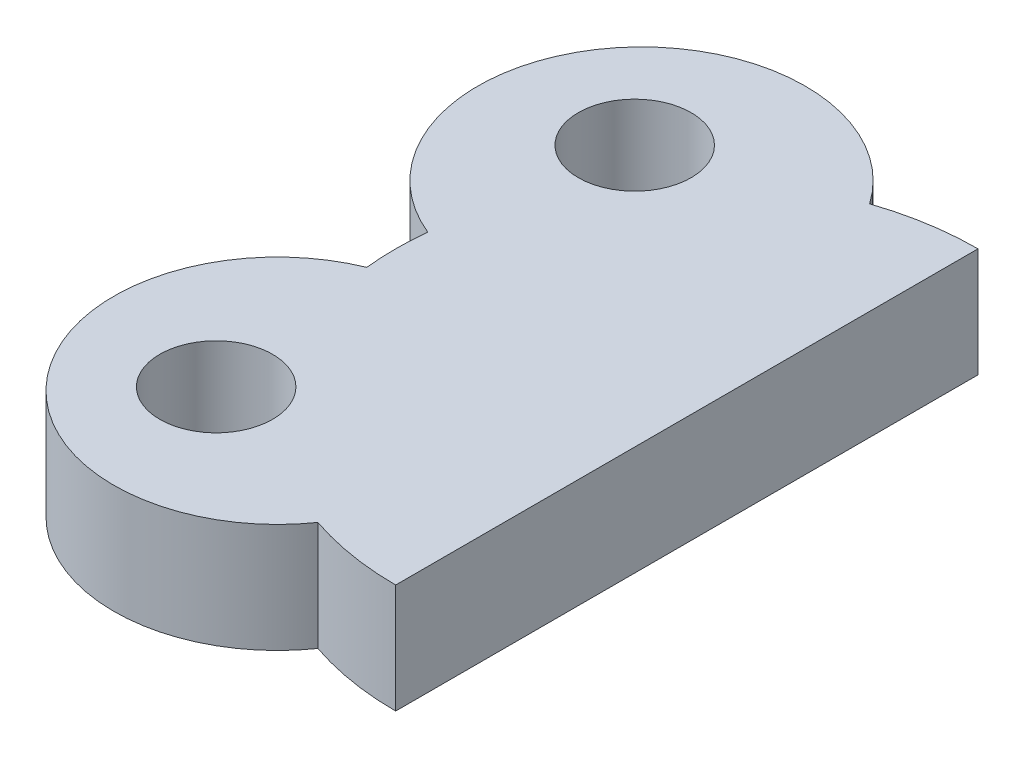
ISO-10303-21;
HEADER;
FILE_DESCRIPTION(('STEP AP214'),'2;1');
FILE_NAME('part.step','',(''),(''),'','','');
FILE_SCHEMA(('AUTOMOTIVE_DESIGN { 1 0 10303 214 1 1 1 1 }'));
ENDSEC;
DATA;
#1=APPLICATION_CONTEXT('core data for automotive mechanical design processes');
#2=APPLICATION_PROTOCOL_DEFINITION('international standard','automotive_design',2000,#1);
#3=PRODUCT_CONTEXT('',#1,'mechanical');
#4=PRODUCT('Part','Part','',(#3));
#5=PRODUCT_RELATED_PRODUCT_CATEGORY('part','',(#4));
#6=PRODUCT_DEFINITION_FORMATION('','',#4);
#7=PRODUCT_DEFINITION_CONTEXT('part definition',#1,'design');
#8=PRODUCT_DEFINITION('design','',#6,#7);
#9=PRODUCT_DEFINITION_SHAPE('','',#8);
#10=(LENGTH_UNIT() NAMED_UNIT(*) SI_UNIT(.MILLI.,.METRE.));
#11=(NAMED_UNIT(*) PLANE_ANGLE_UNIT() SI_UNIT($,.RADIAN.));
#12=(NAMED_UNIT(*) SI_UNIT($,.STERADIAN.) SOLID_ANGLE_UNIT());
#13=UNCERTAINTY_MEASURE_WITH_UNIT(LENGTH_MEASURE(1.E-05),#10,'distance_accuracy_value','');
#14=(GEOMETRIC_REPRESENTATION_CONTEXT(3) GLOBAL_UNCERTAINTY_ASSIGNED_CONTEXT((#13)) GLOBAL_UNIT_ASSIGNED_CONTEXT((#10,
#11,#12)) REPRESENTATION_CONTEXT('',''));
#15=CARTESIAN_POINT('',(0.,0.,0.));
#16=DIRECTION('',(0.,0.,1.));
#17=DIRECTION('',(1.,0.,0.));
#18=AXIS2_PLACEMENT_3D('',#15,#16,#17);
#19=CARTESIAN_POINT('',(-10.5,3.,0.));
#20=DIRECTION('',(0.,-1.,0.));
#21=DIRECTION('',(0.,0.,-1.));
#22=AXIS2_PLACEMENT_3D('',#19,#20,#21);
#23=CYLINDRICAL_SURFACE('',#22,8.);
#24=CARTESIAN_POINT('',(-10.5,0.,0.));
#25=DIRECTION('',(0.,1.,0.));
#26=DIRECTION('',(0.,0.,1.));
#27=AXIS2_PLACEMENT_3D('',#24,#25,#26);
#28=CIRCLE('',#27,8.);
#29=CARTESIAN_POINT('',(-13.0580476745296,0.,7.57999947855103));
#30=VERTEX_POINT('',#29);
#31=CARTESIAN_POINT('',(-10.4999999999999,0.,8.));
#32=VERTEX_POINT('',#31);
#33=EDGE_CURVE('E119',#30,#32,#28,.T.);
#34=ORIENTED_EDGE('',*,*,#33,.T.);
#35=DIRECTION('',(0.,-1.,0.));
#36=VECTOR('',#35,1.);
#37=CARTESIAN_POINT('',(-10.4999999999999,3.,8.));
#38=LINE('',#37,#36);
#39=CARTESIAN_POINT('',(-10.4999999999999,3.,8.));
#40=VERTEX_POINT('',#39);
#41=EDGE_CURVE('E11',#40,#32,#38,.T.);
#42=ORIENTED_EDGE('',*,*,#41,.F.);
#43=CARTESIAN_POINT('',(-10.5,3.,0.));
#44=DIRECTION('',(0.,1.,0.));
#45=DIRECTION('',(0.,0.,1.));
#46=AXIS2_PLACEMENT_3D('',#43,#44,#45);
#47=CIRCLE('',#46,8.);
#48=CARTESIAN_POINT('',(-13.0580476745296,3.,7.57999947855103));
#49=VERTEX_POINT('',#48);
#50=EDGE_CURVE('E130',#49,#40,#47,.T.);
#51=ORIENTED_EDGE('',*,*,#50,.F.);
#52=DIRECTION('',(0.,-1.,0.));
#53=VECTOR('',#52,1.);
#54=CARTESIAN_POINT('',(-13.0580476745296,3.,7.57999947855103));
#55=LINE('',#54,#53);
#56=EDGE_CURVE('E115',#49,#30,#55,.T.);
#57=ORIENTED_EDGE('',*,*,#56,.T.);
#58=EDGE_LOOP('',(#34,#42,#51,#57));
#59=FACE_BOUND('',#58,.T.);
#60=ADVANCED_FACE('F35',(#59),#23,.T.);
#61=CARTESIAN_POINT('',(-10.5,3.,-8.));
#62=DIRECTION('',(-1.,0.,0.));
#63=DIRECTION('',(0.,0.,1.));
#64=AXIS2_PLACEMENT_3D('',#61,#62,#63);
#65=PLANE('',#64);
#66=DIRECTION('',(0.,0.,-1.));
#67=VECTOR('',#66,1.);
#68=CARTESIAN_POINT('',(-10.5,0.,-8.));
#69=LINE('',#68,#67);
#70=CARTESIAN_POINT('',(-10.5,0.,-8.));
#71=VERTEX_POINT('',#70);
#72=EDGE_CURVE('E122',#32,#71,#69,.T.);
#73=ORIENTED_EDGE('',*,*,#72,.T.);
#74=DIRECTION('',(0.,-1.,0.));
#75=VECTOR('',#74,1.);
#76=CARTESIAN_POINT('',(-10.5,3.,-8.));
#77=LINE('',#76,#75);
#78=CARTESIAN_POINT('',(-10.5,3.,-8.));
#79=VERTEX_POINT('',#78);
#80=EDGE_CURVE('E43',#79,#71,#77,.T.);
#81=ORIENTED_EDGE('',*,*,#80,.F.);
#82=DIRECTION('',(0.,0.,-1.));
#83=VECTOR('',#82,1.);
#84=CARTESIAN_POINT('',(-10.5,3.,-8.));
#85=LINE('',#84,#83);
#86=EDGE_CURVE('E88',#40,#79,#85,.T.);
#87=ORIENTED_EDGE('',*,*,#86,.F.);
#88=ORIENTED_EDGE('',*,*,#41,.T.);
#89=EDGE_LOOP('',(#73,#81,#87,#88));
#90=FACE_BOUND('',#89,.T.);
#91=ADVANCED_FACE('F156',(#90),#65,.F.);
#92=CARTESIAN_POINT('',(-10.5,3.,0.));
#93=DIRECTION('',(0.,-1.,0.));
#94=DIRECTION('',(0.,0.,-1.));
#95=AXIS2_PLACEMENT_3D('',#92,#93,#94);
#96=CYLINDRICAL_SURFACE('',#95,8.);
#97=CARTESIAN_POINT('',(-10.5,0.,0.));
#98=DIRECTION('',(0.,1.,0.));
#99=DIRECTION('',(0.,0.,1.));
#100=AXIS2_PLACEMENT_3D('',#97,#98,#99);
#101=CIRCLE('',#100,8.);
#102=CARTESIAN_POINT('',(-13.0580476745296,0.,-7.57999947855103));
#103=VERTEX_POINT('',#102);
#104=EDGE_CURVE('E125',#71,#103,#101,.T.);
#105=ORIENTED_EDGE('',*,*,#104,.T.);
#106=DIRECTION('',(0.,-1.,0.));
#107=VECTOR('',#106,1.);
#108=CARTESIAN_POINT('',(-13.0580476745296,3.,-7.57999947855103));
#109=LINE('',#108,#107);
#110=CARTESIAN_POINT('',(-13.0580476745296,3.,-7.57999947855103));
#111=VERTEX_POINT('',#110);
#112=EDGE_CURVE('E110',#111,#103,#109,.T.);
#113=ORIENTED_EDGE('',*,*,#112,.F.);
#114=CARTESIAN_POINT('',(-10.5,3.,0.));
#115=DIRECTION('',(0.,1.,0.));
#116=DIRECTION('',(0.,0.,1.));
#117=AXIS2_PLACEMENT_3D('',#114,#115,#116);
#118=CIRCLE('',#117,8.);
#119=EDGE_CURVE('E101',#79,#111,#118,.T.);
#120=ORIENTED_EDGE('',*,*,#119,.F.);
#121=ORIENTED_EDGE('',*,*,#80,.T.);
#122=EDGE_LOOP('',(#105,#113,#120,#121));
#123=FACE_BOUND('',#122,.T.);
#124=ADVANCED_FACE('F136',(#123),#96,.T.);
#125=CARTESIAN_POINT('',(-16.7449979983984,3.,-5.));
#126=DIRECTION('',(0.,-1.,0.));
#127=DIRECTION('',(0.,0.,-1.));
#128=AXIS2_PLACEMENT_3D('',#125,#126,#127);
#129=CYLINDRICAL_SURFACE('',#128,4.5);
#130=CARTESIAN_POINT('',(-16.7449979983984,0.,-5.));
#131=DIRECTION('',(0.,1.,0.));
#132=DIRECTION('',(0.,0.,1.));
#133=AXIS2_PLACEMENT_3D('',#130,#131,#132);
#134=CIRCLE('',#133,4.5);
#135=CARTESIAN_POINT('',(-18.4559919243365,0.,-0.837969271448971));
#136=VERTEX_POINT('',#135);
#137=EDGE_CURVE('E109',#103,#136,#134,.T.);
#138=ORIENTED_EDGE('',*,*,#137,.T.);
#139=DIRECTION('',(0.,-1.,0.));
#140=VECTOR('',#139,1.);
#141=CARTESIAN_POINT('',(-18.4559919243365,3.,-0.837969271448971));
#142=LINE('',#141,#140);
#143=CARTESIAN_POINT('',(-18.4559919243365,3.,-0.837969271448971));
#144=VERTEX_POINT('',#143);
#145=EDGE_CURVE('E106',#144,#136,#142,.T.);
#146=ORIENTED_EDGE('',*,*,#145,.F.);
#147=CARTESIAN_POINT('',(-16.7449979983984,3.,-5.));
#148=DIRECTION('',(0.,1.,0.));
#149=DIRECTION('',(0.,0.,1.));
#150=AXIS2_PLACEMENT_3D('',#147,#148,#149);
#151=CIRCLE('',#150,4.5);
#152=EDGE_CURVE('E95',#111,#144,#151,.T.);
#153=ORIENTED_EDGE('',*,*,#152,.F.);
#154=ORIENTED_EDGE('',*,*,#112,.T.);
#155=EDGE_LOOP('',(#138,#146,#153,#154));
#156=FACE_BOUND('',#155,.T.);
#157=ADVANCED_FACE('F107',(#156),#129,.T.);
#158=CARTESIAN_POINT('',(-10.5,3.,0.));
#159=DIRECTION('',(0.,-1.,0.));
#160=DIRECTION('',(0.,0.,-1.));
#161=AXIS2_PLACEMENT_3D('',#158,#159,#160);
#162=CYLINDRICAL_SURFACE('',#161,8.);
#163=CARTESIAN_POINT('',(-10.5,0.,0.));
#164=DIRECTION('',(0.,1.,0.));
#165=DIRECTION('',(0.,0.,1.));
#166=AXIS2_PLACEMENT_3D('',#163,#164,#165);
#167=CIRCLE('',#166,8.);
#168=CARTESIAN_POINT('',(-18.4559919243365,0.,0.837969271448973));
#169=VERTEX_POINT('',#168);
#170=EDGE_CURVE('E74',#136,#169,#167,.T.);
#171=ORIENTED_EDGE('',*,*,#170,.T.);
#172=DIRECTION('',(0.,-1.,0.));
#173=VECTOR('',#172,1.);
#174=CARTESIAN_POINT('',(-18.4559919243365,3.,0.837969271448973));
#175=LINE('',#174,#173);
#176=CARTESIAN_POINT('',(-18.4559919243365,3.,0.837969271448973));
#177=VERTEX_POINT('',#176);
#178=EDGE_CURVE('E111',#177,#169,#175,.T.);
#179=ORIENTED_EDGE('',*,*,#178,.F.);
#180=CARTESIAN_POINT('',(-10.5,3.,0.));
#181=DIRECTION('',(0.,1.,0.));
#182=DIRECTION('',(0.,0.,1.));
#183=AXIS2_PLACEMENT_3D('',#180,#181,#182);
#184=CIRCLE('',#183,8.);
#185=EDGE_CURVE('E99',#144,#177,#184,.T.);
#186=ORIENTED_EDGE('',*,*,#185,.F.);
#187=ORIENTED_EDGE('',*,*,#145,.T.);
#188=EDGE_LOOP('',(#171,#179,#186,#187));
#189=FACE_BOUND('',#188,.T.);
#190=ADVANCED_FACE('F113',(#189),#162,.T.);
#191=CARTESIAN_POINT('',(-16.7449979983984,3.,5.));
#192=DIRECTION('',(0.,-1.,0.));
#193=DIRECTION('',(0.,0.,-1.));
#194=AXIS2_PLACEMENT_3D('',#191,#192,#193);
#195=CYLINDRICAL_SURFACE('',#194,4.5);
#196=CARTESIAN_POINT('',(-16.7449979983984,0.,5.));
#197=DIRECTION('',(0.,1.,0.));
#198=DIRECTION('',(0.,0.,1.));
#199=AXIS2_PLACEMENT_3D('',#196,#197,#198);
#200=CIRCLE('',#199,4.5);
#201=EDGE_CURVE('E80',#169,#30,#200,.T.);
#202=ORIENTED_EDGE('',*,*,#201,.T.);
#203=ORIENTED_EDGE('',*,*,#56,.F.);
#204=CARTESIAN_POINT('',(-16.7449979983984,3.,5.));
#205=DIRECTION('',(0.,1.,0.));
#206=DIRECTION('',(0.,0.,1.));
#207=AXIS2_PLACEMENT_3D('',#204,#205,#206);
#208=CIRCLE('',#207,4.5);
#209=EDGE_CURVE('E51',#177,#49,#208,.T.);
#210=ORIENTED_EDGE('',*,*,#209,.F.);
#211=ORIENTED_EDGE('',*,*,#178,.T.);
#212=EDGE_LOOP('',(#202,#203,#210,#211));
#213=FACE_BOUND('',#212,.T.);
#214=ADVANCED_FACE('F143',(#213),#195,.T.);
#215=CARTESIAN_POINT('',(-10.5,3.,0.));
#216=DIRECTION('',(0.,1.,0.));
#217=DIRECTION('',(0.,0.,1.));
#218=AXIS2_PLACEMENT_3D('',#215,#216,#217);
#219=PLANE('',#218);
#220=CARTESIAN_POINT('',(-17.6817476981575,3.,-5.75000000000067));
#221=DIRECTION('',(0.,1.,0.));
#222=DIRECTION('',(0.,0.,1.));
#223=AXIS2_PLACEMENT_3D('',#220,#221,#222);
#224=CIRCLE('',#223,1.54999999999995);
#225=CARTESIAN_POINT('',(-17.6817476981575,3.,-4.20000000000072));
#226=VERTEX_POINT('',#225);
#227=EDGE_CURVE('E216',#226,#226,#224,.T.);
#228=ORIENTED_EDGE('',*,*,#227,.F.);
#229=EDGE_LOOP('',(#228));
#230=FACE_BOUND('',#229,.T.);
#231=CARTESIAN_POINT('',(-17.6817476981586,3.,5.7499999999993));
#232=DIRECTION('',(0.,1.,0.));
#233=DIRECTION('',(0.,0.,1.));
#234=AXIS2_PLACEMENT_3D('',#231,#232,#233);
#235=CIRCLE('',#234,1.55);
#236=CARTESIAN_POINT('',(-17.6817476981586,3.,7.2999999999993));
#237=VERTEX_POINT('',#236);
#238=EDGE_CURVE('E221',#237,#237,#235,.T.);
#239=ORIENTED_EDGE('',*,*,#238,.F.);
#240=EDGE_LOOP('',(#239));
#241=FACE_BOUND('',#240,.T.);
#242=ORIENTED_EDGE('',*,*,#50,.T.);
#243=ORIENTED_EDGE('',*,*,#86,.T.);
#244=ORIENTED_EDGE('',*,*,#119,.T.);
#245=ORIENTED_EDGE('',*,*,#152,.T.);
#246=ORIENTED_EDGE('',*,*,#185,.T.);
#247=ORIENTED_EDGE('',*,*,#209,.T.);
#248=EDGE_LOOP('',(#242,#243,#244,#245,#246,#247));
#249=FACE_BOUND('',#248,.T.);
#250=ADVANCED_FACE('F97',(#230,#241,#249),#219,.T.);
#251=CARTESIAN_POINT('',(-10.5,0.,0.));
#252=DIRECTION('',(0.,1.,0.));
#253=DIRECTION('',(0.,0.,1.));
#254=AXIS2_PLACEMENT_3D('',#251,#252,#253);
#255=PLANE('',#254);
#256=CARTESIAN_POINT('',(-17.6817476981575,0.,-5.75000000000067));
#257=DIRECTION('',(0.,1.,0.));
#258=DIRECTION('',(0.,0.,1.));
#259=AXIS2_PLACEMENT_3D('',#256,#257,#258);
#260=CIRCLE('',#259,1.54999999999995);
#261=CARTESIAN_POINT('',(-17.6817476981575,0.,-4.20000000000072));
#262=VERTEX_POINT('',#261);
#263=EDGE_CURVE('E123',#262,#262,#260,.T.);
#264=ORIENTED_EDGE('',*,*,#263,.T.);
#265=EDGE_LOOP('',(#264));
#266=FACE_BOUND('',#265,.T.);
#267=CARTESIAN_POINT('',(-17.6817476981586,0.,5.7499999999993));
#268=DIRECTION('',(0.,1.,0.));
#269=DIRECTION('',(0.,0.,1.));
#270=AXIS2_PLACEMENT_3D('',#267,#268,#269);
#271=CIRCLE('',#270,1.55);
#272=CARTESIAN_POINT('',(-17.6817476981586,0.,7.2999999999993));
#273=VERTEX_POINT('',#272);
#274=EDGE_CURVE('E217',#273,#273,#271,.T.);
#275=ORIENTED_EDGE('',*,*,#274,.T.);
#276=EDGE_LOOP('',(#275));
#277=FACE_BOUND('',#276,.T.);
#278=ORIENTED_EDGE('',*,*,#33,.F.);
#279=ORIENTED_EDGE('',*,*,#201,.F.);
#280=ORIENTED_EDGE('',*,*,#170,.F.);
#281=ORIENTED_EDGE('',*,*,#137,.F.);
#282=ORIENTED_EDGE('',*,*,#104,.F.);
#283=ORIENTED_EDGE('',*,*,#72,.F.);
#284=EDGE_LOOP('',(#278,#279,#280,#281,#282,#283));
#285=FACE_BOUND('',#284,.T.);
#286=ADVANCED_FACE('F139',(#266,#277,#285),#255,.F.);
#287=CARTESIAN_POINT('',(-17.6817476981586,0.,5.7499999999993));
#288=DIRECTION('',(0.,1.,0.));
#289=DIRECTION('',(0.,0.,1.));
#290=AXIS2_PLACEMENT_3D('',#287,#288,#289);
#291=CYLINDRICAL_SURFACE('',#290,1.55);
#292=ORIENTED_EDGE('',*,*,#274,.F.);
#293=EDGE_LOOP('',(#292));
#294=FACE_BOUND('',#293,.T.);
#295=ORIENTED_EDGE('',*,*,#238,.T.);
#296=EDGE_LOOP('',(#295));
#297=FACE_BOUND('',#296,.T.);
#298=ADVANCED_FACE('F189',(#294,#297),#291,.F.);
#299=CARTESIAN_POINT('',(-17.6817476981575,0.,-5.75000000000067));
#300=DIRECTION('',(0.,1.,0.));
#301=DIRECTION('',(0.,0.,1.));
#302=AXIS2_PLACEMENT_3D('',#299,#300,#301);
#303=CYLINDRICAL_SURFACE('',#302,1.54999999999995);
#304=ORIENTED_EDGE('',*,*,#263,.F.);
#305=EDGE_LOOP('',(#304));
#306=FACE_BOUND('',#305,.T.);
#307=ORIENTED_EDGE('',*,*,#227,.T.);
#308=EDGE_LOOP('',(#307));
#309=FACE_BOUND('',#308,.T.);
#310=ADVANCED_FACE('F197',(#306,#309),#303,.F.);
#311=CLOSED_SHELL('',(#60,#91,#124,#157,#190,#214,#250,#286,#298,#310));
#312=MANIFOLD_SOLID_BREP('B2',#311);
#313=ADVANCED_BREP_SHAPE_REPRESENTATION('',(#18,#312),#14);
#314=SHAPE_DEFINITION_REPRESENTATION(#9,#313);
ENDSEC;
END-ISO-10303-21;
